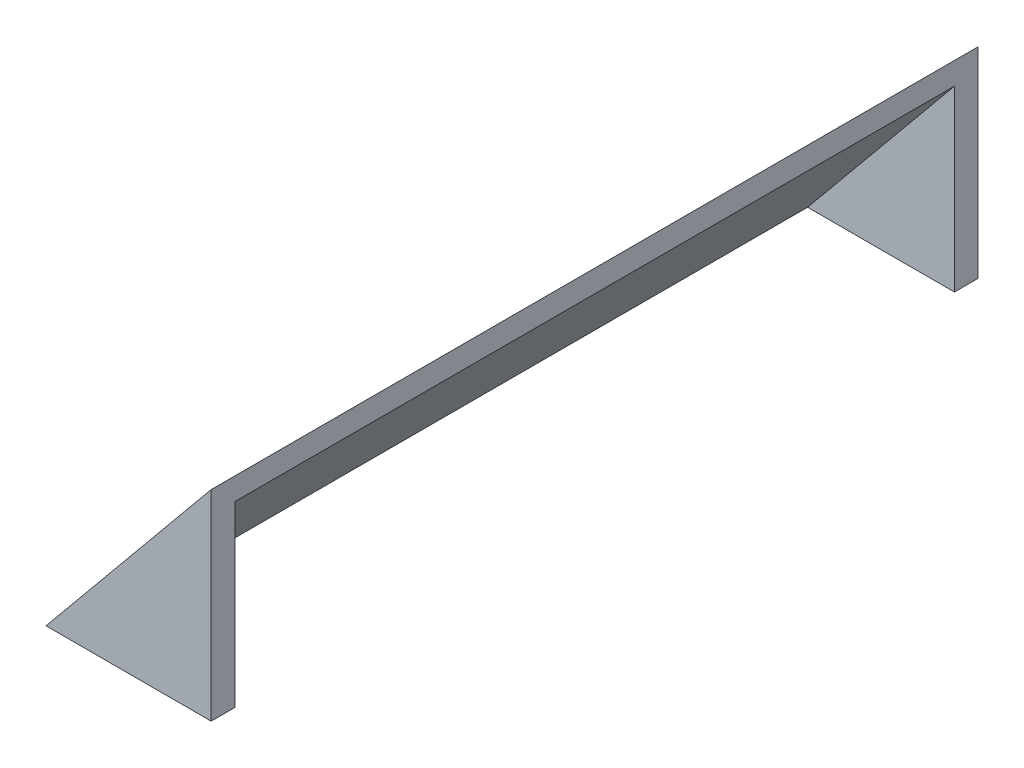
ISO-10303-21;
HEADER;
FILE_DESCRIPTION(('STEP AP214'),'2;1');
FILE_NAME('part.step','',(''),(''),'','','');
FILE_SCHEMA(('AUTOMOTIVE_DESIGN { 1 0 10303 214 1 1 1 1 }'));
ENDSEC;
DATA;
#1=APPLICATION_CONTEXT('core data for automotive mechanical design processes');
#2=APPLICATION_PROTOCOL_DEFINITION('international standard','automotive_design',2000,#1);
#3=PRODUCT_CONTEXT('',#1,'mechanical');
#4=PRODUCT('Part','Part','',(#3));
#5=PRODUCT_RELATED_PRODUCT_CATEGORY('part','',(#4));
#6=PRODUCT_DEFINITION_FORMATION('','',#4);
#7=PRODUCT_DEFINITION_CONTEXT('part definition',#1,'design');
#8=PRODUCT_DEFINITION('design','',#6,#7);
#9=PRODUCT_DEFINITION_SHAPE('','',#8);
#10=(LENGTH_UNIT() NAMED_UNIT(*) SI_UNIT(.MILLI.,.METRE.));
#11=(NAMED_UNIT(*) PLANE_ANGLE_UNIT() SI_UNIT($,.RADIAN.));
#12=(NAMED_UNIT(*) SI_UNIT($,.STERADIAN.) SOLID_ANGLE_UNIT());
#13=UNCERTAINTY_MEASURE_WITH_UNIT(LENGTH_MEASURE(1.E-05),#10,'distance_accuracy_value','');
#14=(GEOMETRIC_REPRESENTATION_CONTEXT(3) GLOBAL_UNCERTAINTY_ASSIGNED_CONTEXT((#13)) GLOBAL_UNIT_ASSIGNED_CONTEXT((#10,
#11,#12)) REPRESENTATION_CONTEXT('',''));
#15=CARTESIAN_POINT('',(0.,0.,0.));
#16=DIRECTION('',(0.,0.,1.));
#17=DIRECTION('',(1.,0.,0.));
#18=AXIS2_PLACEMENT_3D('',#15,#16,#17);
#19=CARTESIAN_POINT('',(-14.,-17.,2.));
#20=DIRECTION('',(0.77193023561705,-0.6357072528611,0.));
#21=DIRECTION('',(0.6357072528611,0.77193023561705,0.));
#22=AXIS2_PLACEMENT_3D('',#19,#20,#21);
#23=PLANE('',#22);
#24=DIRECTION('',(-0.6357072528611,-0.77193023561705,0.));
#25=VECTOR('',#24,1.);
#26=CARTESIAN_POINT('',(-14.,-17.,0.));
#27=LINE('',#26,#25);
#28=CARTESIAN_POINT('',(0.,0.,0.));
#29=VERTEX_POINT('',#28);
#30=CARTESIAN_POINT('',(-14.,-17.,0.));
#31=VERTEX_POINT('',#30);
#32=EDGE_CURVE('E84',#29,#31,#27,.T.);
#33=ORIENTED_EDGE('',*,*,#32,.T.);
#34=DIRECTION('',(0.,0.,-1.));
#35=VECTOR('',#34,1.);
#36=CARTESIAN_POINT('',(-14.,-17.,2.));
#37=LINE('',#36,#35);
#38=CARTESIAN_POINT('',(-14.,-17.,65.));
#39=VERTEX_POINT('',#38);
#40=EDGE_CURVE('E11',#39,#31,#37,.T.);
#41=ORIENTED_EDGE('',*,*,#40,.F.);
#42=DIRECTION('',(-0.6357072528611,-0.77193023561705,0.));
#43=VECTOR('',#42,1.);
#44=CARTESIAN_POINT('',(-14.,-17.,65.));
#45=LINE('',#44,#43);
#46=CARTESIAN_POINT('',(0.,0.,65.));
#47=VERTEX_POINT('',#46);
#48=EDGE_CURVE('E133',#47,#39,#45,.T.);
#49=ORIENTED_EDGE('',*,*,#48,.F.);
#50=DIRECTION('',(0.,0.,-1.));
#51=VECTOR('',#50,1.);
#52=CARTESIAN_POINT('',(0.,0.,2.));
#53=LINE('',#52,#51);
#54=EDGE_CURVE('E93',#47,#29,#53,.T.);
#55=ORIENTED_EDGE('',*,*,#54,.T.);
#56=EDGE_LOOP('',(#33,#41,#49,#55));
#57=FACE_BOUND('',#56,.T.);
#58=ADVANCED_FACE('F39',(#57),#23,.F.);
#59=CARTESIAN_POINT('',(0.,-17.,2.));
#60=DIRECTION('',(0.,1.,0.));
#61=DIRECTION('',(0.,0.,1.));
#62=AXIS2_PLACEMENT_3D('',#59,#60,#61);
#63=PLANE('',#62);
#64=DIRECTION('',(1.,0.,0.));
#65=VECTOR('',#64,1.);
#66=CARTESIAN_POINT('',(0.,-17.,0.));
#67=LINE('',#66,#65);
#68=CARTESIAN_POINT('',(0.,-17.,0.));
#69=VERTEX_POINT('',#68);
#70=EDGE_CURVE('E72',#31,#69,#67,.T.);
#71=ORIENTED_EDGE('',*,*,#70,.T.);
#72=DIRECTION('',(0.,0.,-1.));
#73=VECTOR('',#72,1.);
#74=CARTESIAN_POINT('',(0.,-17.,2.));
#75=LINE('',#74,#73);
#76=CARTESIAN_POINT('',(0.,-17.,2.));
#77=VERTEX_POINT('',#76);
#78=EDGE_CURVE('E47',#77,#69,#75,.T.);
#79=ORIENTED_EDGE('',*,*,#78,.F.);
#80=DIRECTION('',(1.,0.,0.));
#81=VECTOR('',#80,1.);
#82=CARTESIAN_POINT('',(0.,-17.,2.));
#83=LINE('',#82,#81);
#84=CARTESIAN_POINT('',(-12.4454553732556,-17.,2.));
#85=VERTEX_POINT('',#84);
#86=EDGE_CURVE('E58',#85,#77,#83,.T.);
#87=ORIENTED_EDGE('',*,*,#86,.F.);
#88=DIRECTION('',(0.,0.,-1.));
#89=VECTOR('',#88,1.);
#90=CARTESIAN_POINT('',(-12.4454553732556,-17.,63.));
#91=LINE('',#90,#89);
#92=CARTESIAN_POINT('',(-12.4454553732556,-17.,63.));
#93=VERTEX_POINT('',#92);
#94=EDGE_CURVE('E108',#93,#85,#91,.T.);
#95=ORIENTED_EDGE('',*,*,#94,.F.);
#96=DIRECTION('',(1.,0.,0.));
#97=VECTOR('',#96,1.);
#98=CARTESIAN_POINT('',(0.,-17.,63.));
#99=LINE('',#98,#97);
#100=CARTESIAN_POINT('',(0.,-17.,63.));
#101=VERTEX_POINT('',#100);
#102=EDGE_CURVE('E134',#93,#101,#99,.T.);
#103=ORIENTED_EDGE('',*,*,#102,.T.);
#104=DIRECTION('',(0.,0.,-1.));
#105=VECTOR('',#104,1.);
#106=CARTESIAN_POINT('',(0.,-17.,65.));
#107=LINE('',#106,#105);
#108=CARTESIAN_POINT('',(0.,-17.,65.));
#109=VERTEX_POINT('',#108);
#110=EDGE_CURVE('E121',#109,#101,#107,.T.);
#111=ORIENTED_EDGE('',*,*,#110,.F.);
#112=DIRECTION('',(1.,0.,0.));
#113=VECTOR('',#112,1.);
#114=CARTESIAN_POINT('',(0.,-17.,65.));
#115=LINE('',#114,#113);
#116=EDGE_CURVE('E141',#39,#109,#115,.T.);
#117=ORIENTED_EDGE('',*,*,#116,.F.);
#118=ORIENTED_EDGE('',*,*,#40,.T.);
#119=EDGE_LOOP('',(#71,#79,#87,#95,#103,#111,#117,#118));
#120=FACE_BOUND('',#119,.T.);
#121=ADVANCED_FACE('F74',(#120),#63,.F.);
#122=CARTESIAN_POINT('',(0.,0.,2.));
#123=DIRECTION('',(-1.,0.,0.));
#124=DIRECTION('',(0.,-1.,0.));
#125=AXIS2_PLACEMENT_3D('',#122,#123,#124);
#126=PLANE('',#125);
#127=DIRECTION('',(0.,1.,0.));
#128=VECTOR('',#127,1.);
#129=CARTESIAN_POINT('',(0.,0.,0.));
#130=LINE('',#129,#128);
#131=EDGE_CURVE('E83',#69,#29,#130,.T.);
#132=ORIENTED_EDGE('',*,*,#131,.T.);
#133=ORIENTED_EDGE('',*,*,#54,.F.);
#134=DIRECTION('',(0.,1.,0.));
#135=VECTOR('',#134,1.);
#136=CARTESIAN_POINT('',(0.,0.,65.));
#137=LINE('',#136,#135);
#138=EDGE_CURVE('E128',#109,#47,#137,.T.);
#139=ORIENTED_EDGE('',*,*,#138,.F.);
#140=ORIENTED_EDGE('',*,*,#110,.T.);
#141=DIRECTION('',(0.,1.,0.));
#142=VECTOR('',#141,1.);
#143=CARTESIAN_POINT('',(0.,0.,63.));
#144=LINE('',#143,#142);
#145=CARTESIAN_POINT('',(0.,-1.8876613324753,63.));
#146=VERTEX_POINT('',#145);
#147=EDGE_CURVE('E129',#101,#146,#144,.T.);
#148=ORIENTED_EDGE('',*,*,#147,.T.);
#149=DIRECTION('',(0.,0.,-1.));
#150=VECTOR('',#149,1.);
#151=CARTESIAN_POINT('',(0.,-1.8876613324753,63.));
#152=LINE('',#151,#150);
#153=CARTESIAN_POINT('',(0.,-1.8876613324753,2.));
#154=VERTEX_POINT('',#153);
#155=EDGE_CURVE('E111',#146,#154,#152,.T.);
#156=ORIENTED_EDGE('',*,*,#155,.T.);
#157=DIRECTION('',(0.,1.,0.));
#158=VECTOR('',#157,1.);
#159=CARTESIAN_POINT('',(0.,0.,2.));
#160=LINE('',#159,#158);
#161=EDGE_CURVE('E91',#77,#154,#160,.T.);
#162=ORIENTED_EDGE('',*,*,#161,.F.);
#163=ORIENTED_EDGE('',*,*,#78,.T.);
#164=EDGE_LOOP('',(#132,#133,#139,#140,#148,#156,#162,#163));
#165=FACE_BOUND('',#164,.T.);
#166=ADVANCED_FACE('F87',(#165),#126,.F.);
#167=CARTESIAN_POINT('',(0.,0.,2.));
#168=DIRECTION('',(0.,0.,1.));
#169=DIRECTION('',(1.,0.,0.));
#170=AXIS2_PLACEMENT_3D('',#167,#168,#169);
#171=PLANE('',#170);
#172=DIRECTION('',(0.6357072528611,0.77193023561705,0.));
#173=VECTOR('',#172,1.);
#174=CARTESIAN_POINT('',(-12.4454553732556,-17.,2.));
#175=LINE('',#174,#173);
#176=EDGE_CURVE('E54',#85,#154,#175,.T.);
#177=ORIENTED_EDGE('',*,*,#176,.F.);
#178=ORIENTED_EDGE('',*,*,#86,.T.);
#179=ORIENTED_EDGE('',*,*,#161,.T.);
#180=EDGE_LOOP('',(#177,#178,#179));
#181=FACE_BOUND('',#180,.T.);
#182=ADVANCED_FACE('F182',(#181),#171,.T.);
#183=CARTESIAN_POINT('',(0.,0.,0.));
#184=DIRECTION('',(0.,0.,1.));
#185=DIRECTION('',(1.,0.,0.));
#186=AXIS2_PLACEMENT_3D('',#183,#184,#185);
#187=PLANE('',#186);
#188=ORIENTED_EDGE('',*,*,#32,.F.);
#189=ORIENTED_EDGE('',*,*,#131,.F.);
#190=ORIENTED_EDGE('',*,*,#70,.F.);
#191=EDGE_LOOP('',(#188,#189,#190));
#192=FACE_BOUND('',#191,.T.);
#193=ADVANCED_FACE('F94',(#192),#187,.F.);
#194=CARTESIAN_POINT('',(-12.4454553732556,-17.,63.));
#195=DIRECTION('',(-0.77193023561705,0.635707252861099,0.));
#196=DIRECTION('',(-0.6357072528611,-0.77193023561705,0.));
#197=AXIS2_PLACEMENT_3D('',#194,#195,#196);
#198=PLANE('',#197);
#199=ORIENTED_EDGE('',*,*,#176,.T.);
#200=ORIENTED_EDGE('',*,*,#155,.F.);
#201=DIRECTION('',(0.6357072528611,0.77193023561705,0.));
#202=VECTOR('',#201,1.);
#203=CARTESIAN_POINT('',(-12.4454553732556,-17.,63.));
#204=LINE('',#203,#202);
#205=EDGE_CURVE('E116',#93,#146,#204,.T.);
#206=ORIENTED_EDGE('',*,*,#205,.F.);
#207=ORIENTED_EDGE('',*,*,#94,.T.);
#208=EDGE_LOOP('',(#199,#200,#206,#207));
#209=FACE_BOUND('',#208,.T.);
#210=ADVANCED_FACE('F163',(#209),#198,.F.);
#211=CARTESIAN_POINT('',(0.,0.,63.));
#212=DIRECTION('',(0.,0.,1.));
#213=DIRECTION('',(1.,0.,0.));
#214=AXIS2_PLACEMENT_3D('',#211,#212,#213);
#215=PLANE('',#214);
#216=ORIENTED_EDGE('',*,*,#102,.F.);
#217=ORIENTED_EDGE('',*,*,#205,.T.);
#218=ORIENTED_EDGE('',*,*,#147,.F.);
#219=EDGE_LOOP('',(#216,#217,#218));
#220=FACE_BOUND('',#219,.T.);
#221=ADVANCED_FACE('F166',(#220),#215,.F.);
#222=CARTESIAN_POINT('',(0.,0.,65.));
#223=DIRECTION('',(0.,0.,1.));
#224=DIRECTION('',(1.,0.,0.));
#225=AXIS2_PLACEMENT_3D('',#222,#223,#224);
#226=PLANE('',#225);
#227=ORIENTED_EDGE('',*,*,#48,.T.);
#228=ORIENTED_EDGE('',*,*,#116,.T.);
#229=ORIENTED_EDGE('',*,*,#138,.T.);
#230=EDGE_LOOP('',(#227,#228,#229));
#231=FACE_BOUND('',#230,.T.);
#232=ADVANCED_FACE('F149',(#231),#226,.T.);
#233=CLOSED_SHELL('',(#58,#121,#166,#182,#193,#210,#221,#232));
#234=MANIFOLD_SOLID_BREP('B2',#233);
#235=ADVANCED_BREP_SHAPE_REPRESENTATION('',(#18,#234),#14);
#236=SHAPE_DEFINITION_REPRESENTATION(#9,#235);
ENDSEC;
END-ISO-10303-21;
